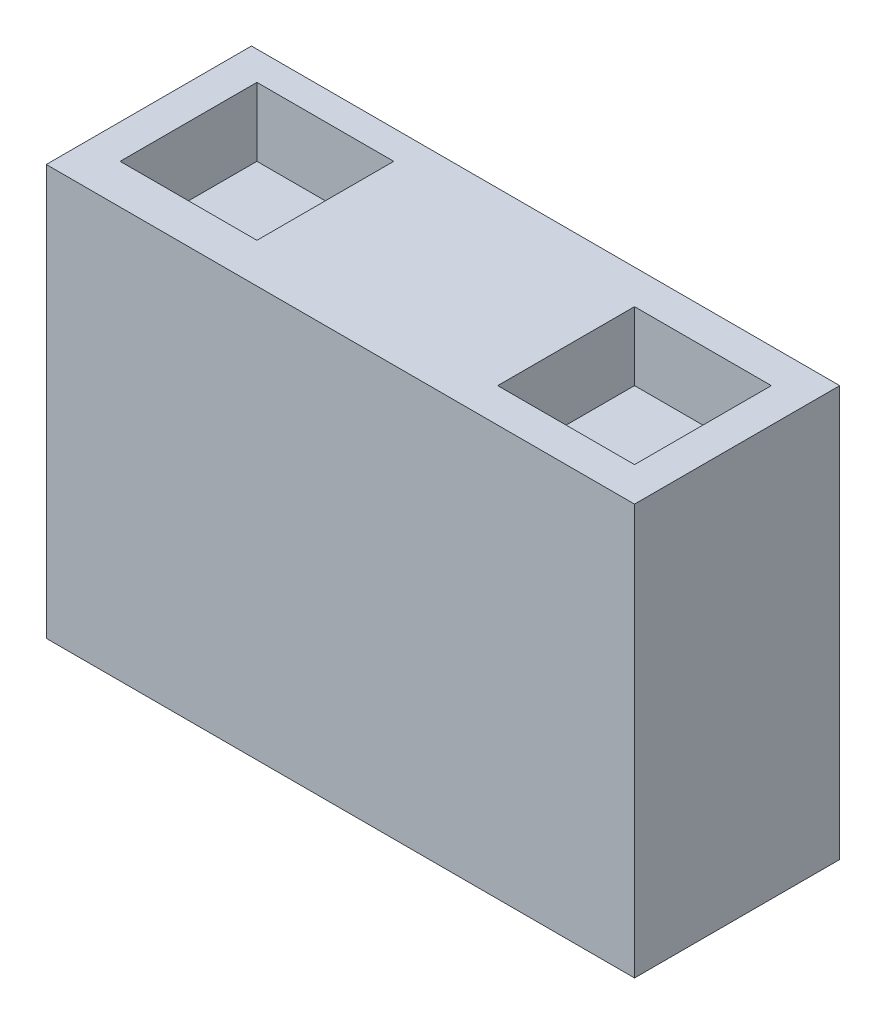
ISO-10303-21;
HEADER;
FILE_DESCRIPTION(('STEP AP214'),'2;1');
FILE_NAME('part.step','',(''),(''),'','','');
FILE_SCHEMA(('AUTOMOTIVE_DESIGN { 1 0 10303 214 1 1 1 1 }'));
ENDSEC;
DATA;
#1=APPLICATION_CONTEXT('core data for automotive mechanical design processes');
#2=APPLICATION_PROTOCOL_DEFINITION('international standard','automotive_design',2000,#1);
#3=PRODUCT_CONTEXT('',#1,'mechanical');
#4=PRODUCT('Part','Part','',(#3));
#5=PRODUCT_RELATED_PRODUCT_CATEGORY('part','',(#4));
#6=PRODUCT_DEFINITION_FORMATION('','',#4);
#7=PRODUCT_DEFINITION_CONTEXT('part definition',#1,'design');
#8=PRODUCT_DEFINITION('design','',#6,#7);
#9=PRODUCT_DEFINITION_SHAPE('','',#8);
#10=(LENGTH_UNIT() NAMED_UNIT(*) SI_UNIT(.MILLI.,.METRE.));
#11=(NAMED_UNIT(*) PLANE_ANGLE_UNIT() SI_UNIT($,.RADIAN.));
#12=(NAMED_UNIT(*) SI_UNIT($,.STERADIAN.) SOLID_ANGLE_UNIT());
#13=UNCERTAINTY_MEASURE_WITH_UNIT(LENGTH_MEASURE(1.E-05),#10,'distance_accuracy_value','');
#14=(GEOMETRIC_REPRESENTATION_CONTEXT(3) GLOBAL_UNCERTAINTY_ASSIGNED_CONTEXT((#13)) GLOBAL_UNIT_ASSIGNED_CONTEXT((#10,
#11,#12)) REPRESENTATION_CONTEXT('',''));
#15=CARTESIAN_POINT('',(0.,0.,0.));
#16=DIRECTION('',(0.,0.,1.));
#17=DIRECTION('',(1.,0.,0.));
#18=AXIS2_PLACEMENT_3D('',#15,#16,#17);
#19=CARTESIAN_POINT('',(-14.2686493988445,13.7582781456954,15.));
#20=DIRECTION('',(1.,0.,0.));
#21=DIRECTION('',(0.,1.,0.));
#22=AXIS2_PLACEMENT_3D('',#19,#20,#21);
#23=PLANE('',#22);
#24=DIRECTION('',(0.,-1.,0.));
#25=VECTOR('',#24,1.);
#26=CARTESIAN_POINT('',(-14.2686493988445,13.7582781456954,0.));
#27=LINE('',#26,#25);
#28=CARTESIAN_POINT('',(-14.2686493988445,13.7582781456954,0.));
#29=VERTEX_POINT('',#28);
#30=CARTESIAN_POINT('',(-14.2686493988445,-16.2417218543046,0.));
#31=VERTEX_POINT('',#30);
#32=EDGE_CURVE('E174',#29,#31,#27,.T.);
#33=ORIENTED_EDGE('',*,*,#32,.T.);
#34=DIRECTION('',(0.,0.,-1.));
#35=VECTOR('',#34,1.);
#36=CARTESIAN_POINT('',(-14.2686493988445,-16.2417218543046,15.));
#37=LINE('',#36,#35);
#38=CARTESIAN_POINT('',(-14.2686493988445,-16.2417218543046,15.));
#39=VERTEX_POINT('',#38);
#40=EDGE_CURVE('E11',#39,#31,#37,.T.);
#41=ORIENTED_EDGE('',*,*,#40,.F.);
#42=DIRECTION('',(0.,-1.,0.));
#43=VECTOR('',#42,1.);
#44=CARTESIAN_POINT('',(-14.2686493988445,13.7582781456954,15.));
#45=LINE('',#44,#43);
#46=CARTESIAN_POINT('',(-14.2686493988445,13.7582781456954,15.));
#47=VERTEX_POINT('',#46);
#48=EDGE_CURVE('E221',#47,#39,#45,.T.);
#49=ORIENTED_EDGE('',*,*,#48,.F.);
#50=DIRECTION('',(0.,0.,-1.));
#51=VECTOR('',#50,1.);
#52=CARTESIAN_POINT('',(-14.2686493988445,13.7582781456954,15.));
#53=LINE('',#52,#51);
#54=EDGE_CURVE('E235',#47,#29,#53,.T.);
#55=ORIENTED_EDGE('',*,*,#54,.T.);
#56=EDGE_LOOP('',(#33,#41,#49,#55));
#57=FACE_BOUND('',#56,.T.);
#58=ADVANCED_FACE('F39',(#57),#23,.F.);
#59=CARTESIAN_POINT('',(-14.2686493988445,-16.2417218543046,15.));
#60=DIRECTION('',(0.,1.,0.));
#61=DIRECTION('',(0.,0.,1.));
#62=AXIS2_PLACEMENT_3D('',#59,#60,#61);
#63=PLANE('',#62);
#64=DIRECTION('',(1.,0.,0.));
#65=VECTOR('',#64,1.);
#66=CARTESIAN_POINT('',(-14.2686493988445,-16.2417218543046,0.));
#67=LINE('',#66,#65);
#68=CARTESIAN_POINT('',(28.7313506011555,-16.2417218543046,0.));
#69=VERTEX_POINT('',#68);
#70=EDGE_CURVE('E239',#31,#69,#67,.T.);
#71=ORIENTED_EDGE('',*,*,#70,.T.);
#72=DIRECTION('',(0.,0.,-1.));
#73=VECTOR('',#72,1.);
#74=CARTESIAN_POINT('',(28.7313506011555,-16.2417218543046,15.));
#75=LINE('',#74,#73);
#76=CARTESIAN_POINT('',(28.7313506011555,-16.2417218543046,15.));
#77=VERTEX_POINT('',#76);
#78=EDGE_CURVE('E47',#77,#69,#75,.T.);
#79=ORIENTED_EDGE('',*,*,#78,.F.);
#80=DIRECTION('',(1.,0.,0.));
#81=VECTOR('',#80,1.);
#82=CARTESIAN_POINT('',(-14.2686493988445,-16.2417218543046,15.));
#83=LINE('',#82,#81);
#84=EDGE_CURVE('E225',#39,#77,#83,.T.);
#85=ORIENTED_EDGE('',*,*,#84,.F.);
#86=ORIENTED_EDGE('',*,*,#40,.T.);
#87=EDGE_LOOP('',(#71,#79,#85,#86));
#88=FACE_BOUND('',#87,.T.);
#89=ADVANCED_FACE('F275',(#88),#63,.F.);
#90=CARTESIAN_POINT('',(28.7313506011555,13.7582781456954,15.));
#91=DIRECTION('',(-1.,0.,0.));
#92=DIRECTION('',(0.,0.,1.));
#93=AXIS2_PLACEMENT_3D('',#90,#91,#92);
#94=PLANE('',#93);
#95=DIRECTION('',(0.,1.,0.));
#96=VECTOR('',#95,1.);
#97=CARTESIAN_POINT('',(28.7313506011555,13.7582781456954,0.));
#98=LINE('',#97,#96);
#99=CARTESIAN_POINT('',(28.7313506011555,13.7582781456954,0.));
#100=VERTEX_POINT('',#99);
#101=EDGE_CURVE('E242',#69,#100,#98,.T.);
#102=ORIENTED_EDGE('',*,*,#101,.T.);
#103=DIRECTION('',(0.,0.,-1.));
#104=VECTOR('',#103,1.);
#105=CARTESIAN_POINT('',(28.7313506011555,13.7582781456954,15.));
#106=LINE('',#105,#104);
#107=CARTESIAN_POINT('',(28.7313506011555,13.7582781456954,15.));
#108=VERTEX_POINT('',#107);
#109=EDGE_CURVE('E250',#108,#100,#106,.T.);
#110=ORIENTED_EDGE('',*,*,#109,.F.);
#111=DIRECTION('',(0.,1.,0.));
#112=VECTOR('',#111,1.);
#113=CARTESIAN_POINT('',(28.7313506011555,13.7582781456954,15.));
#114=LINE('',#113,#112);
#115=EDGE_CURVE('E229',#77,#108,#114,.T.);
#116=ORIENTED_EDGE('',*,*,#115,.F.);
#117=ORIENTED_EDGE('',*,*,#78,.T.);
#118=EDGE_LOOP('',(#102,#110,#116,#117));
#119=FACE_BOUND('',#118,.T.);
#120=ADVANCED_FACE('F259',(#119),#94,.F.);
#121=CARTESIAN_POINT('',(-14.2686493988445,13.7582781456954,15.));
#122=DIRECTION('',(0.,-1.,0.));
#123=DIRECTION('',(0.,0.,-1.));
#124=AXIS2_PLACEMENT_3D('',#121,#122,#123);
#125=PLANE('',#124);
#126=DIRECTION('',(1.,0.,0.));
#127=VECTOR('',#126,1.);
#128=CARTESIAN_POINT('',(-11.7686493988445,13.7582781456954,12.101659199092));
#129=LINE('',#128,#127);
#130=CARTESIAN_POINT('',(-11.7686493988445,13.7582781456954,12.101659199092));
#131=VERTEX_POINT('',#130);
#132=CARTESIAN_POINT('',(-1.76864939884446,13.7582781456954,12.101659199092));
#133=VERTEX_POINT('',#132);
#134=EDGE_CURVE('E164',#131,#133,#129,.T.);
#135=ORIENTED_EDGE('',*,*,#134,.F.);
#136=DIRECTION('',(0.,0.,1.));
#137=VECTOR('',#136,1.);
#138=CARTESIAN_POINT('',(-11.7686493988445,13.7582781456954,2.101659199092));
#139=LINE('',#138,#137);
#140=CARTESIAN_POINT('',(-11.7686493988445,13.7582781456954,2.101659199092));
#141=VERTEX_POINT('',#140);
#142=EDGE_CURVE('E54',#141,#131,#139,.T.);
#143=ORIENTED_EDGE('',*,*,#142,.F.);
#144=DIRECTION('',(-1.,0.,0.));
#145=VECTOR('',#144,1.);
#146=CARTESIAN_POINT('',(-11.7686493988445,13.7582781456954,2.101659199092));
#147=LINE('',#146,#145);
#148=CARTESIAN_POINT('',(-1.76864939884446,13.7582781456954,2.101659199092));
#149=VERTEX_POINT('',#148);
#150=EDGE_CURVE('E151',#149,#141,#147,.T.);
#151=ORIENTED_EDGE('',*,*,#150,.F.);
#152=DIRECTION('',(0.,0.,-1.));
#153=VECTOR('',#152,1.);
#154=CARTESIAN_POINT('',(-1.76864939884446,13.7582781456954,2.101659199092));
#155=LINE('',#154,#153);
#156=EDGE_CURVE('E155',#133,#149,#155,.T.);
#157=ORIENTED_EDGE('',*,*,#156,.F.);
#158=EDGE_LOOP('',(#135,#143,#151,#157));
#159=FACE_BOUND('',#158,.T.);
#160=DIRECTION('',(1.,0.,0.));
#161=VECTOR('',#160,1.);
#162=CARTESIAN_POINT('',(16.2313506011555,13.7582781456954,12.5));
#163=LINE('',#162,#161);
#164=CARTESIAN_POINT('',(16.2313506011555,13.7582781456954,12.5));
#165=VERTEX_POINT('',#164);
#166=CARTESIAN_POINT('',(26.2313506011555,13.7582781456954,12.5));
#167=VERTEX_POINT('',#166);
#168=EDGE_CURVE('E200',#165,#167,#163,.T.);
#169=ORIENTED_EDGE('',*,*,#168,.F.);
#170=DIRECTION('',(0.,0.,1.));
#171=VECTOR('',#170,1.);
#172=CARTESIAN_POINT('',(16.2313506011555,13.7582781456954,2.5));
#173=LINE('',#172,#171);
#174=CARTESIAN_POINT('',(16.2313506011555,13.7582781456954,2.5));
#175=VERTEX_POINT('',#174);
#176=EDGE_CURVE('E62',#175,#165,#173,.T.);
#177=ORIENTED_EDGE('',*,*,#176,.F.);
#178=DIRECTION('',(-1.,0.,0.));
#179=VECTOR('',#178,1.);
#180=CARTESIAN_POINT('',(16.2313506011555,13.7582781456954,2.5));
#181=LINE('',#180,#179);
#182=CARTESIAN_POINT('',(26.2313506011555,13.7582781456954,2.5));
#183=VERTEX_POINT('',#182);
#184=EDGE_CURVE('E185',#183,#175,#181,.T.);
#185=ORIENTED_EDGE('',*,*,#184,.F.);
#186=DIRECTION('',(0.,0.,-1.));
#187=VECTOR('',#186,1.);
#188=CARTESIAN_POINT('',(26.2313506011555,13.7582781456954,2.5));
#189=LINE('',#188,#187);
#190=EDGE_CURVE('E204',#167,#183,#189,.T.);
#191=ORIENTED_EDGE('',*,*,#190,.F.);
#192=EDGE_LOOP('',(#169,#177,#185,#191));
#193=FACE_BOUND('',#192,.T.);
#194=DIRECTION('',(-1.,0.,0.));
#195=VECTOR('',#194,1.);
#196=CARTESIAN_POINT('',(-14.2686493988445,13.7582781456954,0.));
#197=LINE('',#196,#195);
#198=EDGE_CURVE('E226',#100,#29,#197,.T.);
#199=ORIENTED_EDGE('',*,*,#198,.T.);
#200=ORIENTED_EDGE('',*,*,#54,.F.);
#201=DIRECTION('',(-1.,0.,0.));
#202=VECTOR('',#201,1.);
#203=CARTESIAN_POINT('',(-14.2686493988445,13.7582781456954,15.));
#204=LINE('',#203,#202);
#205=EDGE_CURVE('E232',#108,#47,#204,.T.);
#206=ORIENTED_EDGE('',*,*,#205,.F.);
#207=ORIENTED_EDGE('',*,*,#109,.T.);
#208=EDGE_LOOP('',(#199,#200,#206,#207));
#209=FACE_BOUND('',#208,.T.);
#210=ADVANCED_FACE('F268',(#159,#193,#209),#125,.F.);
#211=CARTESIAN_POINT('',(0.,0.,15.));
#212=DIRECTION('',(0.,0.,1.));
#213=DIRECTION('',(1.,0.,0.));
#214=AXIS2_PLACEMENT_3D('',#211,#212,#213);
#215=PLANE('',#214);
#216=ORIENTED_EDGE('',*,*,#48,.T.);
#217=ORIENTED_EDGE('',*,*,#84,.T.);
#218=ORIENTED_EDGE('',*,*,#115,.T.);
#219=ORIENTED_EDGE('',*,*,#205,.T.);
#220=EDGE_LOOP('',(#216,#217,#218,#219));
#221=FACE_BOUND('',#220,.T.);
#222=ADVANCED_FACE('F274',(#221),#215,.T.);
#223=CARTESIAN_POINT('',(0.,0.,0.));
#224=DIRECTION('',(0.,0.,1.));
#225=DIRECTION('',(1.,0.,0.));
#226=AXIS2_PLACEMENT_3D('',#223,#224,#225);
#227=PLANE('',#226);
#228=ORIENTED_EDGE('',*,*,#32,.F.);
#229=ORIENTED_EDGE('',*,*,#198,.F.);
#230=ORIENTED_EDGE('',*,*,#101,.F.);
#231=ORIENTED_EDGE('',*,*,#70,.F.);
#232=EDGE_LOOP('',(#228,#229,#230,#231));
#233=FACE_BOUND('',#232,.T.);
#234=ADVANCED_FACE('F265',(#233),#227,.F.);
#235=CARTESIAN_POINT('',(16.2313506011555,8.75827814569537,2.5));
#236=DIRECTION('',(-1.,0.,0.));
#237=DIRECTION('',(0.,0.,1.));
#238=AXIS2_PLACEMENT_3D('',#235,#236,#237);
#239=PLANE('',#238);
#240=ORIENTED_EDGE('',*,*,#176,.T.);
#241=DIRECTION('',(0.,1.,0.));
#242=VECTOR('',#241,1.);
#243=CARTESIAN_POINT('',(16.2313506011555,8.75827814569537,12.5));
#244=LINE('',#243,#242);
#245=CARTESIAN_POINT('',(16.2313506011555,8.75827814569537,12.5));
#246=VERTEX_POINT('',#245);
#247=EDGE_CURVE('E197',#246,#165,#244,.T.);
#248=ORIENTED_EDGE('',*,*,#247,.F.);
#249=DIRECTION('',(0.,0.,1.));
#250=VECTOR('',#249,1.);
#251=CARTESIAN_POINT('',(16.2313506011555,8.75827814569537,2.5));
#252=LINE('',#251,#250);
#253=CARTESIAN_POINT('',(16.2313506011555,8.75827814569537,2.5));
#254=VERTEX_POINT('',#253);
#255=EDGE_CURVE('E180',#254,#246,#252,.T.);
#256=ORIENTED_EDGE('',*,*,#255,.F.);
#257=DIRECTION('',(0.,1.,0.));
#258=VECTOR('',#257,1.);
#259=CARTESIAN_POINT('',(16.2313506011555,8.75827814569537,2.5));
#260=LINE('',#259,#258);
#261=EDGE_CURVE('E165',#254,#175,#260,.T.);
#262=ORIENTED_EDGE('',*,*,#261,.T.);
#263=EDGE_LOOP('',(#240,#248,#256,#262));
#264=FACE_BOUND('',#263,.T.);
#265=ADVANCED_FACE('F288',(#264),#239,.F.);
#266=CARTESIAN_POINT('',(16.2313506011555,8.75827814569537,2.5));
#267=DIRECTION('',(0.,0.,-1.));
#268=DIRECTION('',(-1.,0.,0.));
#269=AXIS2_PLACEMENT_3D('',#266,#267,#268);
#270=PLANE('',#269);
#271=ORIENTED_EDGE('',*,*,#184,.T.);
#272=ORIENTED_EDGE('',*,*,#261,.F.);
#273=DIRECTION('',(-1.,0.,0.));
#274=VECTOR('',#273,1.);
#275=CARTESIAN_POINT('',(16.2313506011555,8.75827814569537,2.5));
#276=LINE('',#275,#274);
#277=CARTESIAN_POINT('',(26.2313506011555,8.75827814569537,2.5));
#278=VERTEX_POINT('',#277);
#279=EDGE_CURVE('E193',#278,#254,#276,.T.);
#280=ORIENTED_EDGE('',*,*,#279,.F.);
#281=DIRECTION('',(0.,1.,0.));
#282=VECTOR('',#281,1.);
#283=CARTESIAN_POINT('',(26.2313506011555,8.75827814569537,2.5));
#284=LINE('',#283,#282);
#285=EDGE_CURVE('E213',#278,#183,#284,.T.);
#286=ORIENTED_EDGE('',*,*,#285,.T.);
#287=EDGE_LOOP('',(#271,#272,#280,#286));
#288=FACE_BOUND('',#287,.T.);
#289=ADVANCED_FACE('F293',(#288),#270,.F.);
#290=CARTESIAN_POINT('',(26.2313506011555,8.75827814569537,2.5));
#291=DIRECTION('',(1.,0.,0.));
#292=DIRECTION('',(0.,0.,-1.));
#293=AXIS2_PLACEMENT_3D('',#290,#291,#292);
#294=PLANE('',#293);
#295=ORIENTED_EDGE('',*,*,#190,.T.);
#296=ORIENTED_EDGE('',*,*,#285,.F.);
#297=DIRECTION('',(0.,0.,-1.));
#298=VECTOR('',#297,1.);
#299=CARTESIAN_POINT('',(26.2313506011555,8.75827814569537,2.5));
#300=LINE('',#299,#298);
#301=CARTESIAN_POINT('',(26.2313506011555,8.75827814569537,12.5));
#302=VERTEX_POINT('',#301);
#303=EDGE_CURVE('E189',#302,#278,#300,.T.);
#304=ORIENTED_EDGE('',*,*,#303,.F.);
#305=DIRECTION('',(0.,1.,0.));
#306=VECTOR('',#305,1.);
#307=CARTESIAN_POINT('',(26.2313506011555,8.75827814569537,12.5));
#308=LINE('',#307,#306);
#309=EDGE_CURVE('E216',#302,#167,#308,.T.);
#310=ORIENTED_EDGE('',*,*,#309,.T.);
#311=EDGE_LOOP('',(#295,#296,#304,#310));
#312=FACE_BOUND('',#311,.T.);
#313=ADVANCED_FACE('F298',(#312),#294,.F.);
#314=CARTESIAN_POINT('',(16.2313506011555,8.75827814569537,12.5));
#315=DIRECTION('',(0.,0.,1.));
#316=DIRECTION('',(1.,0.,0.));
#317=AXIS2_PLACEMENT_3D('',#314,#315,#316);
#318=PLANE('',#317);
#319=ORIENTED_EDGE('',*,*,#168,.T.);
#320=ORIENTED_EDGE('',*,*,#309,.F.);
#321=DIRECTION('',(1.,0.,0.));
#322=VECTOR('',#321,1.);
#323=CARTESIAN_POINT('',(16.2313506011555,8.75827814569537,12.5));
#324=LINE('',#323,#322);
#325=EDGE_CURVE('E184',#246,#302,#324,.T.);
#326=ORIENTED_EDGE('',*,*,#325,.F.);
#327=ORIENTED_EDGE('',*,*,#247,.T.);
#328=EDGE_LOOP('',(#319,#320,#326,#327));
#329=FACE_BOUND('',#328,.T.);
#330=ADVANCED_FACE('F294',(#329),#318,.F.);
#331=CARTESIAN_POINT('',(0.,8.75827814569537,0.));
#332=DIRECTION('',(0.,1.,0.));
#333=DIRECTION('',(0.,0.,1.));
#334=AXIS2_PLACEMENT_3D('',#331,#332,#333);
#335=PLANE('',#334);
#336=ORIENTED_EDGE('',*,*,#255,.T.);
#337=ORIENTED_EDGE('',*,*,#325,.T.);
#338=ORIENTED_EDGE('',*,*,#303,.T.);
#339=ORIENTED_EDGE('',*,*,#279,.T.);
#340=EDGE_LOOP('',(#336,#337,#338,#339));
#341=FACE_BOUND('',#340,.T.);
#342=ADVANCED_FACE('F297',(#341),#335,.T.);
#343=CARTESIAN_POINT('',(-11.7686493988445,8.75827814569537,2.101659199092));
#344=DIRECTION('',(-1.,0.,0.));
#345=DIRECTION('',(0.,0.,1.));
#346=AXIS2_PLACEMENT_3D('',#343,#344,#345);
#347=PLANE('',#346);
#348=ORIENTED_EDGE('',*,*,#142,.T.);
#349=DIRECTION('',(0.,1.,0.));
#350=VECTOR('',#349,1.);
#351=CARTESIAN_POINT('',(-11.7686493988445,8.75827814569537,12.101659199092));
#352=LINE('',#351,#350);
#353=CARTESIAN_POINT('',(-11.7686493988445,8.75827814569537,12.101659199092));
#354=VERTEX_POINT('',#353);
#355=EDGE_CURVE('E126',#354,#131,#352,.T.);
#356=ORIENTED_EDGE('',*,*,#355,.F.);
#357=DIRECTION('',(0.,0.,1.));
#358=VECTOR('',#357,1.);
#359=CARTESIAN_POINT('',(-11.7686493988445,8.75827814569537,2.101659199092));
#360=LINE('',#359,#358);
#361=CARTESIAN_POINT('',(-11.7686493988445,8.75827814569537,2.101659199092));
#362=VERTEX_POINT('',#361);
#363=EDGE_CURVE('E130',#362,#354,#360,.T.);
#364=ORIENTED_EDGE('',*,*,#363,.F.);
#365=DIRECTION('',(0.,1.,0.));
#366=VECTOR('',#365,1.);
#367=CARTESIAN_POINT('',(-11.7686493988445,8.75827814569537,2.101659199092));
#368=LINE('',#367,#366);
#369=EDGE_CURVE('E171',#362,#141,#368,.T.);
#370=ORIENTED_EDGE('',*,*,#369,.T.);
#371=EDGE_LOOP('',(#348,#356,#364,#370));
#372=FACE_BOUND('',#371,.T.);
#373=ADVANCED_FACE('F128',(#372),#347,.F.);
#374=CARTESIAN_POINT('',(-11.7686493988445,8.75827814569537,2.101659199092));
#375=DIRECTION('',(0.,0.,-1.));
#376=DIRECTION('',(-1.,0.,0.));
#377=AXIS2_PLACEMENT_3D('',#374,#375,#376);
#378=PLANE('',#377);
#379=ORIENTED_EDGE('',*,*,#150,.T.);
#380=ORIENTED_EDGE('',*,*,#369,.F.);
#381=DIRECTION('',(-1.,0.,0.));
#382=VECTOR('',#381,1.);
#383=CARTESIAN_POINT('',(-11.7686493988445,8.75827814569537,2.101659199092));
#384=LINE('',#383,#382);
#385=CARTESIAN_POINT('',(-1.76864939884446,8.75827814569537,2.101659199092));
#386=VERTEX_POINT('',#385);
#387=EDGE_CURVE('E137',#386,#362,#384,.T.);
#388=ORIENTED_EDGE('',*,*,#387,.F.);
#389=DIRECTION('',(0.,1.,0.));
#390=VECTOR('',#389,1.);
#391=CARTESIAN_POINT('',(-1.76864939884446,8.75827814569537,2.101659199092));
#392=LINE('',#391,#390);
#393=EDGE_CURVE('E175',#386,#149,#392,.T.);
#394=ORIENTED_EDGE('',*,*,#393,.T.);
#395=EDGE_LOOP('',(#379,#380,#388,#394));
#396=FACE_BOUND('',#395,.T.);
#397=ADVANCED_FACE('F311',(#396),#378,.F.);
#398=CARTESIAN_POINT('',(-1.76864939884446,8.75827814569537,2.101659199092));
#399=DIRECTION('',(1.,0.,0.));
#400=DIRECTION('',(0.,0.,-1.));
#401=AXIS2_PLACEMENT_3D('',#398,#399,#400);
#402=PLANE('',#401);
#403=ORIENTED_EDGE('',*,*,#156,.T.);
#404=ORIENTED_EDGE('',*,*,#393,.F.);
#405=DIRECTION('',(0.,0.,-1.));
#406=VECTOR('',#405,1.);
#407=CARTESIAN_POINT('',(-1.76864939884446,8.75827814569537,2.101659199092));
#408=LINE('',#407,#406);
#409=CARTESIAN_POINT('',(-1.76864939884446,8.75827814569537,12.101659199092));
#410=VERTEX_POINT('',#409);
#411=EDGE_CURVE('E146',#410,#386,#408,.T.);
#412=ORIENTED_EDGE('',*,*,#411,.F.);
#413=DIRECTION('',(0.,1.,0.));
#414=VECTOR('',#413,1.);
#415=CARTESIAN_POINT('',(-1.76864939884446,8.75827814569537,12.101659199092));
#416=LINE('',#415,#414);
#417=EDGE_CURVE('E136',#410,#133,#416,.T.);
#418=ORIENTED_EDGE('',*,*,#417,.T.);
#419=EDGE_LOOP('',(#403,#404,#412,#418));
#420=FACE_BOUND('',#419,.T.);
#421=ADVANCED_FACE('F314',(#420),#402,.F.);
#422=CARTESIAN_POINT('',(-11.7686493988445,8.75827814569537,12.101659199092));
#423=DIRECTION('',(0.,0.,1.));
#424=DIRECTION('',(1.,0.,0.));
#425=AXIS2_PLACEMENT_3D('',#422,#423,#424);
#426=PLANE('',#425);
#427=ORIENTED_EDGE('',*,*,#134,.T.);
#428=ORIENTED_EDGE('',*,*,#417,.F.);
#429=DIRECTION('',(1.,0.,0.));
#430=VECTOR('',#429,1.);
#431=CARTESIAN_POINT('',(-11.7686493988445,8.75827814569537,12.101659199092));
#432=LINE('',#431,#430);
#433=EDGE_CURVE('E140',#354,#410,#432,.T.);
#434=ORIENTED_EDGE('',*,*,#433,.F.);
#435=ORIENTED_EDGE('',*,*,#355,.T.);
#436=EDGE_LOOP('',(#427,#428,#434,#435));
#437=FACE_BOUND('',#436,.T.);
#438=ADVANCED_FACE('F141',(#437),#426,.F.);
#439=CARTESIAN_POINT('',(0.,8.75827814569537,0.));
#440=DIRECTION('',(0.,1.,0.));
#441=DIRECTION('',(0.,0.,1.));
#442=AXIS2_PLACEMENT_3D('',#439,#440,#441);
#443=PLANE('',#442);
#444=ORIENTED_EDGE('',*,*,#363,.T.);
#445=ORIENTED_EDGE('',*,*,#433,.T.);
#446=ORIENTED_EDGE('',*,*,#411,.T.);
#447=ORIENTED_EDGE('',*,*,#387,.T.);
#448=EDGE_LOOP('',(#444,#445,#446,#447));
#449=FACE_BOUND('',#448,.T.);
#450=ADVANCED_FACE('F148',(#449),#443,.T.);
#451=CLOSED_SHELL('',(#58,#89,#120,#210,#222,#234,#265,#289,#313,#330,#342,#373,#397,#421,#438,#450));
#452=MANIFOLD_SOLID_BREP('B2',#451);
#453=ADVANCED_BREP_SHAPE_REPRESENTATION('',(#18,#452),#14);
#454=SHAPE_DEFINITION_REPRESENTATION(#9,#453);
ENDSEC;
END-ISO-10303-21;
